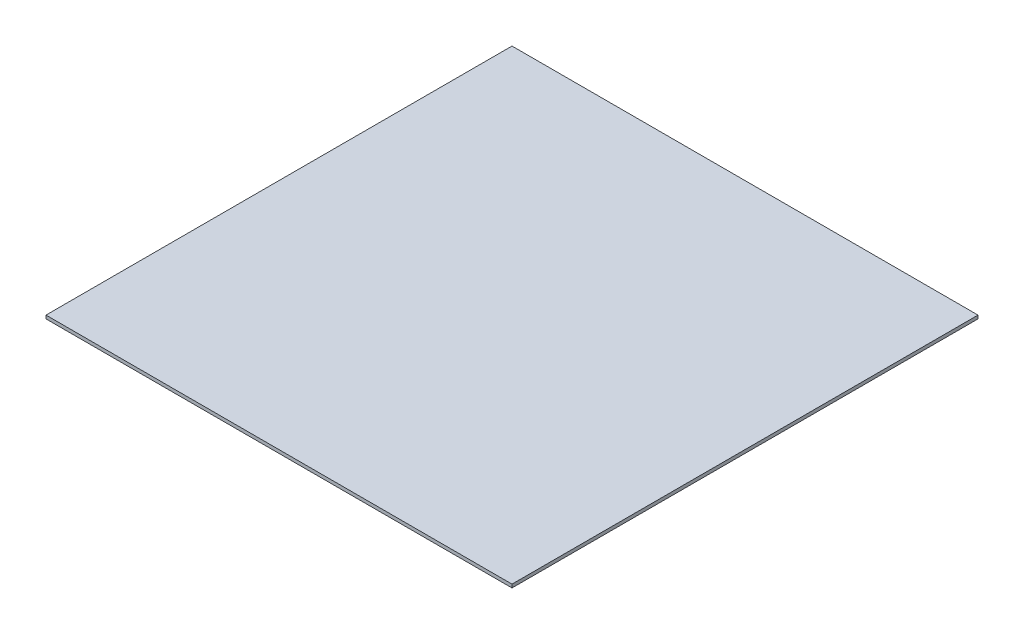
ISO-10303-21;
HEADER;
FILE_DESCRIPTION(('STEP AP214'),'2;1');
FILE_NAME('part.step','',(''),(''),'','','');
FILE_SCHEMA(('AUTOMOTIVE_DESIGN { 1 0 10303 214 1 1 1 1 }'));
ENDSEC;
DATA;
#1=APPLICATION_CONTEXT('core data for automotive mechanical design processes');
#2=APPLICATION_PROTOCOL_DEFINITION('international standard','automotive_design',2000,#1);
#3=PRODUCT_CONTEXT('',#1,'mechanical');
#4=PRODUCT('Part','Part','',(#3));
#5=PRODUCT_RELATED_PRODUCT_CATEGORY('part','',(#4));
#6=PRODUCT_DEFINITION_FORMATION('','',#4);
#7=PRODUCT_DEFINITION_CONTEXT('part definition',#1,'design');
#8=PRODUCT_DEFINITION('design','',#6,#7);
#9=PRODUCT_DEFINITION_SHAPE('','',#8);
#10=(LENGTH_UNIT() NAMED_UNIT(*) SI_UNIT(.MILLI.,.METRE.));
#11=(NAMED_UNIT(*) PLANE_ANGLE_UNIT() SI_UNIT($,.RADIAN.));
#12=(NAMED_UNIT(*) SI_UNIT($,.STERADIAN.) SOLID_ANGLE_UNIT());
#13=UNCERTAINTY_MEASURE_WITH_UNIT(LENGTH_MEASURE(1.E-05),#10,'distance_accuracy_value','');
#14=(GEOMETRIC_REPRESENTATION_CONTEXT(3) GLOBAL_UNCERTAINTY_ASSIGNED_CONTEXT((#13)) GLOBAL_UNIT_ASSIGNED_CONTEXT((#10,
#11,#12)) REPRESENTATION_CONTEXT('',''));
#15=CARTESIAN_POINT('',(0.,0.,0.));
#16=DIRECTION('',(0.,0.,1.));
#17=DIRECTION('',(1.,0.,0.));
#18=AXIS2_PLACEMENT_3D('',#15,#16,#17);
#19=CARTESIAN_POINT('',(69.85,1.,-69.85));
#20=DIRECTION('',(-1.,0.,0.));
#21=DIRECTION('',(0.,0.,1.));
#22=AXIS2_PLACEMENT_3D('',#19,#20,#21);
#23=PLANE('',#22);
#24=DIRECTION('',(0.,0.,-1.));
#25=VECTOR('',#24,1.);
#26=CARTESIAN_POINT('',(69.85,0.,-69.85));
#27=LINE('',#26,#25);
#28=CARTESIAN_POINT('',(69.85,0.,69.85));
#29=VERTEX_POINT('',#28);
#30=CARTESIAN_POINT('',(69.85,0.,-69.85));
#31=VERTEX_POINT('',#30);
#32=EDGE_CURVE('E107',#29,#31,#27,.T.);
#33=ORIENTED_EDGE('',*,*,#32,.T.);
#34=DIRECTION('',(0.,-1.,0.));
#35=VECTOR('',#34,1.);
#36=CARTESIAN_POINT('',(69.85,1.,-69.85));
#37=LINE('',#36,#35);
#38=CARTESIAN_POINT('',(69.85,1.,-69.85));
#39=VERTEX_POINT('',#38);
#40=EDGE_CURVE('E11',#39,#31,#37,.T.);
#41=ORIENTED_EDGE('',*,*,#40,.F.);
#42=DIRECTION('',(0.,0.,-1.));
#43=VECTOR('',#42,1.);
#44=CARTESIAN_POINT('',(69.85,1.,-69.85));
#45=LINE('',#44,#43);
#46=CARTESIAN_POINT('',(69.85,1.,69.85));
#47=VERTEX_POINT('',#46);
#48=EDGE_CURVE('E91',#47,#39,#45,.T.);
#49=ORIENTED_EDGE('',*,*,#48,.F.);
#50=DIRECTION('',(0.,-1.,0.));
#51=VECTOR('',#50,1.);
#52=CARTESIAN_POINT('',(69.85,1.,69.85));
#53=LINE('',#52,#51);
#54=EDGE_CURVE('E103',#47,#29,#53,.T.);
#55=ORIENTED_EDGE('',*,*,#54,.T.);
#56=EDGE_LOOP('',(#33,#41,#49,#55));
#57=FACE_BOUND('',#56,.T.);
#58=ADVANCED_FACE('F39',(#57),#23,.F.);
#59=CARTESIAN_POINT('',(-69.85,1.,-69.85));
#60=DIRECTION('',(0.,0.,1.));
#61=DIRECTION('',(1.,0.,0.));
#62=AXIS2_PLACEMENT_3D('',#59,#60,#61);
#63=PLANE('',#62);
#64=DIRECTION('',(-1.,0.,0.));
#65=VECTOR('',#64,1.);
#66=CARTESIAN_POINT('',(-69.85,0.,-69.85));
#67=LINE('',#66,#65);
#68=CARTESIAN_POINT('',(-69.85,0.,-69.85));
#69=VERTEX_POINT('',#68);
#70=EDGE_CURVE('E96',#31,#69,#67,.T.);
#71=ORIENTED_EDGE('',*,*,#70,.T.);
#72=DIRECTION('',(0.,-1.,0.));
#73=VECTOR('',#72,1.);
#74=CARTESIAN_POINT('',(-69.85,1.,-69.85));
#75=LINE('',#74,#73);
#76=CARTESIAN_POINT('',(-69.85,1.,-69.85));
#77=VERTEX_POINT('',#76);
#78=EDGE_CURVE('E48',#77,#69,#75,.T.);
#79=ORIENTED_EDGE('',*,*,#78,.F.);
#80=DIRECTION('',(-1.,0.,0.));
#81=VECTOR('',#80,1.);
#82=CARTESIAN_POINT('',(-69.85,1.,-69.85));
#83=LINE('',#82,#81);
#84=EDGE_CURVE('E86',#39,#77,#83,.T.);
#85=ORIENTED_EDGE('',*,*,#84,.F.);
#86=ORIENTED_EDGE('',*,*,#40,.T.);
#87=EDGE_LOOP('',(#71,#79,#85,#86));
#88=FACE_BOUND('',#87,.T.);
#89=ADVANCED_FACE('F95',(#88),#63,.F.);
#90=CARTESIAN_POINT('',(-69.85,1.,-69.85));
#91=DIRECTION('',(1.,0.,0.));
#92=DIRECTION('',(0.,0.,-1.));
#93=AXIS2_PLACEMENT_3D('',#90,#91,#92);
#94=PLANE('',#93);
#95=DIRECTION('',(0.,0.,1.));
#96=VECTOR('',#95,1.);
#97=CARTESIAN_POINT('',(-69.85,0.,-69.85));
#98=LINE('',#97,#96);
#99=CARTESIAN_POINT('',(-69.85,0.,69.85));
#100=VERTEX_POINT('',#99);
#101=EDGE_CURVE('E73',#69,#100,#98,.T.);
#102=ORIENTED_EDGE('',*,*,#101,.T.);
#103=DIRECTION('',(0.,-1.,0.));
#104=VECTOR('',#103,1.);
#105=CARTESIAN_POINT('',(-69.85,1.,69.85));
#106=LINE('',#105,#104);
#107=CARTESIAN_POINT('',(-69.85,1.,69.85));
#108=VERTEX_POINT('',#107);
#109=EDGE_CURVE('E98',#108,#100,#106,.T.);
#110=ORIENTED_EDGE('',*,*,#109,.F.);
#111=DIRECTION('',(0.,0.,1.));
#112=VECTOR('',#111,1.);
#113=CARTESIAN_POINT('',(-69.85,1.,-69.85));
#114=LINE('',#113,#112);
#115=EDGE_CURVE('E89',#77,#108,#114,.T.);
#116=ORIENTED_EDGE('',*,*,#115,.F.);
#117=ORIENTED_EDGE('',*,*,#78,.T.);
#118=EDGE_LOOP('',(#102,#110,#116,#117));
#119=FACE_BOUND('',#118,.T.);
#120=ADVANCED_FACE('F99',(#119),#94,.F.);
#121=CARTESIAN_POINT('',(-69.85,1.,69.85));
#122=DIRECTION('',(0.,0.,-1.));
#123=DIRECTION('',(-1.,0.,0.));
#124=AXIS2_PLACEMENT_3D('',#121,#122,#123);
#125=PLANE('',#124);
#126=DIRECTION('',(1.,0.,0.));
#127=VECTOR('',#126,1.);
#128=CARTESIAN_POINT('',(-69.85,0.,69.85));
#129=LINE('',#128,#127);
#130=EDGE_CURVE('E79',#100,#29,#129,.T.);
#131=ORIENTED_EDGE('',*,*,#130,.T.);
#132=ORIENTED_EDGE('',*,*,#54,.F.);
#133=DIRECTION('',(1.,0.,0.));
#134=VECTOR('',#133,1.);
#135=CARTESIAN_POINT('',(-69.85,1.,69.85));
#136=LINE('',#135,#134);
#137=EDGE_CURVE('E56',#108,#47,#136,.T.);
#138=ORIENTED_EDGE('',*,*,#137,.F.);
#139=ORIENTED_EDGE('',*,*,#109,.T.);
#140=EDGE_LOOP('',(#131,#132,#138,#139));
#141=FACE_BOUND('',#140,.T.);
#142=ADVANCED_FACE('F120',(#141),#125,.F.);
#143=CARTESIAN_POINT('',(0.,1.,0.));
#144=DIRECTION('',(0.,1.,0.));
#145=DIRECTION('',(0.,0.,1.));
#146=AXIS2_PLACEMENT_3D('',#143,#144,#145);
#147=PLANE('',#146);
#148=ORIENTED_EDGE('',*,*,#48,.T.);
#149=ORIENTED_EDGE('',*,*,#84,.T.);
#150=ORIENTED_EDGE('',*,*,#115,.T.);
#151=ORIENTED_EDGE('',*,*,#137,.T.);
#152=EDGE_LOOP('',(#148,#149,#150,#151));
#153=FACE_BOUND('',#152,.T.);
#154=ADVANCED_FACE('F87',(#153),#147,.T.);
#155=CARTESIAN_POINT('',(0.,0.,0.));
#156=DIRECTION('',(0.,1.,0.));
#157=DIRECTION('',(0.,0.,1.));
#158=AXIS2_PLACEMENT_3D('',#155,#156,#157);
#159=PLANE('',#158);
#160=ORIENTED_EDGE('',*,*,#32,.F.);
#161=ORIENTED_EDGE('',*,*,#130,.F.);
#162=ORIENTED_EDGE('',*,*,#101,.F.);
#163=ORIENTED_EDGE('',*,*,#70,.F.);
#164=EDGE_LOOP('',(#160,#161,#162,#163));
#165=FACE_BOUND('',#164,.T.);
#166=ADVANCED_FACE('F123',(#165),#159,.F.);
#167=CLOSED_SHELL('',(#58,#89,#120,#142,#154,#166));
#168=MANIFOLD_SOLID_BREP('B2',#167);
#169=ADVANCED_BREP_SHAPE_REPRESENTATION('',(#18,#168),#14);
#170=SHAPE_DEFINITION_REPRESENTATION(#9,#169);
ENDSEC;
END-ISO-10303-21;
